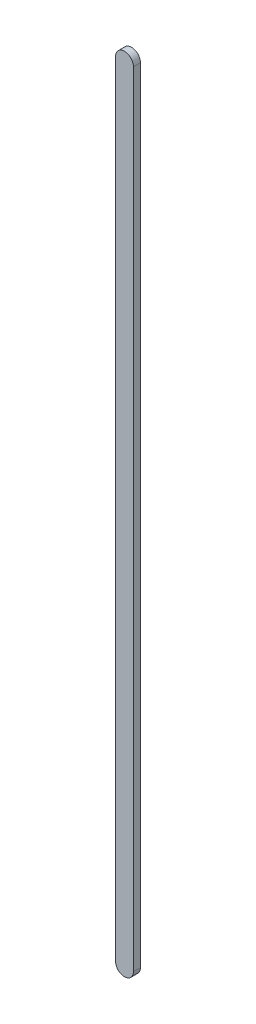
ISO-10303-21;
HEADER;
FILE_DESCRIPTION(('STEP AP214'),'2;1');
FILE_NAME('part.step','',(''),(''),'','','');
FILE_SCHEMA(('AUTOMOTIVE_DESIGN { 1 0 10303 214 1 1 1 1 }'));
ENDSEC;
DATA;
#1=APPLICATION_CONTEXT('core data for automotive mechanical design processes');
#2=APPLICATION_PROTOCOL_DEFINITION('international standard','automotive_design',2000,#1);
#3=PRODUCT_CONTEXT('',#1,'mechanical');
#4=PRODUCT('Part','Part','',(#3));
#5=PRODUCT_RELATED_PRODUCT_CATEGORY('part','',(#4));
#6=PRODUCT_DEFINITION_FORMATION('','',#4);
#7=PRODUCT_DEFINITION_CONTEXT('part definition',#1,'design');
#8=PRODUCT_DEFINITION('design','',#6,#7);
#9=PRODUCT_DEFINITION_SHAPE('','',#8);
#10=(LENGTH_UNIT() NAMED_UNIT(*) SI_UNIT(.MILLI.,.METRE.));
#11=(NAMED_UNIT(*) PLANE_ANGLE_UNIT() SI_UNIT($,.RADIAN.));
#12=(NAMED_UNIT(*) SI_UNIT($,.STERADIAN.) SOLID_ANGLE_UNIT());
#13=UNCERTAINTY_MEASURE_WITH_UNIT(LENGTH_MEASURE(1.E-05),#10,'distance_accuracy_value','');
#14=(GEOMETRIC_REPRESENTATION_CONTEXT(3) GLOBAL_UNCERTAINTY_ASSIGNED_CONTEXT((#13)) GLOBAL_UNIT_ASSIGNED_CONTEXT((#10,
#11,#12)) REPRESENTATION_CONTEXT('',''));
#15=CARTESIAN_POINT('',(0.,0.,0.));
#16=DIRECTION('',(0.,0.,1.));
#17=DIRECTION('',(1.,0.,0.));
#18=AXIS2_PLACEMENT_3D('',#15,#16,#17);
#19=CARTESIAN_POINT('',(155.702,96.774,0.));
#20=DIRECTION('',(-1.,0.,0.));
#21=DIRECTION('',(0.,1.,0.));
#22=AXIS2_PLACEMENT_3D('',#19,#20,#21);
#23=PLANE('',#22);
#24=DIRECTION('',(0.,1.,0.));
#25=VECTOR('',#24,1.);
#26=CARTESIAN_POINT('',(155.702,96.774,0.1999996));
#27=LINE('',#26,#25);
#28=CARTESIAN_POINT('',(155.702,96.774,0.1999996));
#29=VERTEX_POINT('',#28);
#30=CARTESIAN_POINT('',(155.702,118.999,0.1999996));
#31=VERTEX_POINT('',#30);
#32=EDGE_CURVE('E11',#29,#31,#27,.T.);
#33=ORIENTED_EDGE('',*,*,#32,.F.);
#34=DIRECTION('',(0.,0.,1.));
#35=VECTOR('',#34,1.);
#36=CARTESIAN_POINT('',(155.702,96.774,0.));
#37=LINE('',#36,#35);
#38=CARTESIAN_POINT('',(155.702,96.774,0.));
#39=VERTEX_POINT('',#38);
#40=EDGE_CURVE('E24',#39,#29,#37,.T.);
#41=ORIENTED_EDGE('',*,*,#40,.F.);
#42=DIRECTION('',(0.,1.,0.));
#43=VECTOR('',#42,1.);
#44=CARTESIAN_POINT('',(155.702,96.774,0.));
#45=LINE('',#44,#43);
#46=CARTESIAN_POINT('',(155.702,118.999,0.));
#47=VERTEX_POINT('',#46);
#48=EDGE_CURVE('E75',#39,#47,#45,.T.);
#49=ORIENTED_EDGE('',*,*,#48,.T.);
#50=DIRECTION('',(0.,0.,1.));
#51=VECTOR('',#50,1.);
#52=CARTESIAN_POINT('',(155.702,118.999,0.));
#53=LINE('',#52,#51);
#54=EDGE_CURVE('E37',#47,#31,#53,.T.);
#55=ORIENTED_EDGE('',*,*,#54,.T.);
#56=EDGE_LOOP('',(#33,#41,#49,#55));
#57=FACE_BOUND('',#56,.T.);
#58=ADVANCED_FACE('F17',(#57),#23,.F.);
#59=CARTESIAN_POINT('',(155.448,118.999,0.));
#60=DIRECTION('',(0.,0.,-1.));
#61=DIRECTION('',(1.,0.,0.));
#62=AXIS2_PLACEMENT_3D('',#59,#60,#61);
#63=CYLINDRICAL_SURFACE('',#62,0.254);
#64=CARTESIAN_POINT('',(155.448,118.999,0.1999996));
#65=DIRECTION('',(0.,0.,1.));
#66=DIRECTION('',(1.,0.,0.));
#67=AXIS2_PLACEMENT_3D('',#64,#65,#66);
#68=CIRCLE('',#67,0.254);
#69=CARTESIAN_POINT('',(155.194,118.999,0.1999996));
#70=VERTEX_POINT('',#69);
#71=EDGE_CURVE('E83',#31,#70,#68,.T.);
#72=ORIENTED_EDGE('',*,*,#71,.F.);
#73=ORIENTED_EDGE('',*,*,#54,.F.);
#74=CARTESIAN_POINT('',(155.448,118.999,0.));
#75=DIRECTION('',(0.,0.,1.));
#76=DIRECTION('',(1.,0.,0.));
#77=AXIS2_PLACEMENT_3D('',#74,#75,#76);
#78=CIRCLE('',#77,0.254);
#79=CARTESIAN_POINT('',(155.194,118.999,0.));
#80=VERTEX_POINT('',#79);
#81=EDGE_CURVE('E81',#47,#80,#78,.T.);
#82=ORIENTED_EDGE('',*,*,#81,.T.);
#83=DIRECTION('',(0.,0.,1.));
#84=VECTOR('',#83,1.);
#85=CARTESIAN_POINT('',(155.194,118.999,0.));
#86=LINE('',#85,#84);
#87=EDGE_CURVE('E67',#80,#70,#86,.T.);
#88=ORIENTED_EDGE('',*,*,#87,.T.);
#89=EDGE_LOOP('',(#72,#73,#82,#88));
#90=FACE_BOUND('',#89,.T.);
#91=ADVANCED_FACE('F89',(#90),#63,.T.);
#92=CARTESIAN_POINT('',(155.194,118.999,0.));
#93=DIRECTION('',(1.,0.,0.));
#94=DIRECTION('',(0.,-1.,0.));
#95=AXIS2_PLACEMENT_3D('',#92,#93,#94);
#96=PLANE('',#95);
#97=DIRECTION('',(0.,-1.,0.));
#98=VECTOR('',#97,1.);
#99=CARTESIAN_POINT('',(155.194,118.999,0.1999996));
#100=LINE('',#99,#98);
#101=CARTESIAN_POINT('',(155.194,96.774,0.1999996));
#102=VERTEX_POINT('',#101);
#103=EDGE_CURVE('E71',#70,#102,#100,.T.);
#104=ORIENTED_EDGE('',*,*,#103,.F.);
#105=ORIENTED_EDGE('',*,*,#87,.F.);
#106=DIRECTION('',(0.,-1.,0.));
#107=VECTOR('',#106,1.);
#108=CARTESIAN_POINT('',(155.194,118.999,0.));
#109=LINE('',#108,#107);
#110=CARTESIAN_POINT('',(155.194,96.774,0.));
#111=VERTEX_POINT('',#110);
#112=EDGE_CURVE('E63',#80,#111,#109,.T.);
#113=ORIENTED_EDGE('',*,*,#112,.T.);
#114=DIRECTION('',(0.,0.,1.));
#115=VECTOR('',#114,1.);
#116=CARTESIAN_POINT('',(155.194,96.774,0.));
#117=LINE('',#116,#115);
#118=EDGE_CURVE('E53',#111,#102,#117,.T.);
#119=ORIENTED_EDGE('',*,*,#118,.T.);
#120=EDGE_LOOP('',(#104,#105,#113,#119));
#121=FACE_BOUND('',#120,.T.);
#122=ADVANCED_FACE('F66',(#121),#96,.F.);
#123=CARTESIAN_POINT('',(155.448,96.774,0.));
#124=DIRECTION('',(0.,0.,-1.));
#125=DIRECTION('',(-1.,0.,0.));
#126=AXIS2_PLACEMENT_3D('',#123,#124,#125);
#127=CYLINDRICAL_SURFACE('',#126,0.254);
#128=CARTESIAN_POINT('',(155.448,96.774,0.1999996));
#129=DIRECTION('',(0.,0.,1.));
#130=DIRECTION('',(-1.,0.,0.));
#131=AXIS2_PLACEMENT_3D('',#128,#129,#130);
#132=CIRCLE('',#131,0.254);
#133=EDGE_CURVE('E59',#102,#29,#132,.T.);
#134=ORIENTED_EDGE('',*,*,#133,.F.);
#135=ORIENTED_EDGE('',*,*,#118,.F.);
#136=CARTESIAN_POINT('',(155.448,96.774,0.));
#137=DIRECTION('',(0.,0.,1.));
#138=DIRECTION('',(-1.,0.,0.));
#139=AXIS2_PLACEMENT_3D('',#136,#137,#138);
#140=CIRCLE('',#139,0.254);
#141=EDGE_CURVE('E57',#111,#39,#140,.T.);
#142=ORIENTED_EDGE('',*,*,#141,.T.);
#143=ORIENTED_EDGE('',*,*,#40,.T.);
#144=EDGE_LOOP('',(#134,#135,#142,#143));
#145=FACE_BOUND('',#144,.T.);
#146=ADVANCED_FACE('F55',(#145),#127,.T.);
#147=CARTESIAN_POINT('',(155.702,96.774,0.));
#148=DIRECTION('',(0.,0.,-1.));
#149=DIRECTION('',(-1.,0.,0.));
#150=AXIS2_PLACEMENT_3D('',#147,#148,#149);
#151=PLANE('',#150);
#152=ORIENTED_EDGE('',*,*,#141,.F.);
#153=ORIENTED_EDGE('',*,*,#112,.F.);
#154=ORIENTED_EDGE('',*,*,#81,.F.);
#155=ORIENTED_EDGE('',*,*,#48,.F.);
#156=EDGE_LOOP('',(#152,#153,#154,#155));
#157=FACE_BOUND('',#156,.T.);
#158=ADVANCED_FACE('F74',(#157),#151,.T.);
#159=CARTESIAN_POINT('',(155.702,96.774,0.1999996));
#160=DIRECTION('',(0.,0.,-1.));
#161=DIRECTION('',(-1.,0.,0.));
#162=AXIS2_PLACEMENT_3D('',#159,#160,#161);
#163=PLANE('',#162);
#164=ORIENTED_EDGE('',*,*,#32,.T.);
#165=ORIENTED_EDGE('',*,*,#71,.T.);
#166=ORIENTED_EDGE('',*,*,#103,.T.);
#167=ORIENTED_EDGE('',*,*,#133,.T.);
#168=EDGE_LOOP('',(#164,#165,#166,#167));
#169=FACE_BOUND('',#168,.T.);
#170=ADVANCED_FACE('F91',(#169),#163,.F.);
#171=CLOSED_SHELL('',(#58,#91,#122,#146,#158,#170));
#172=MANIFOLD_SOLID_BREP('B1',#171);
#173=ADVANCED_BREP_SHAPE_REPRESENTATION('',(#18,#172),#14);
#174=SHAPE_DEFINITION_REPRESENTATION(#9,#173);
ENDSEC;
END-ISO-10303-21;
